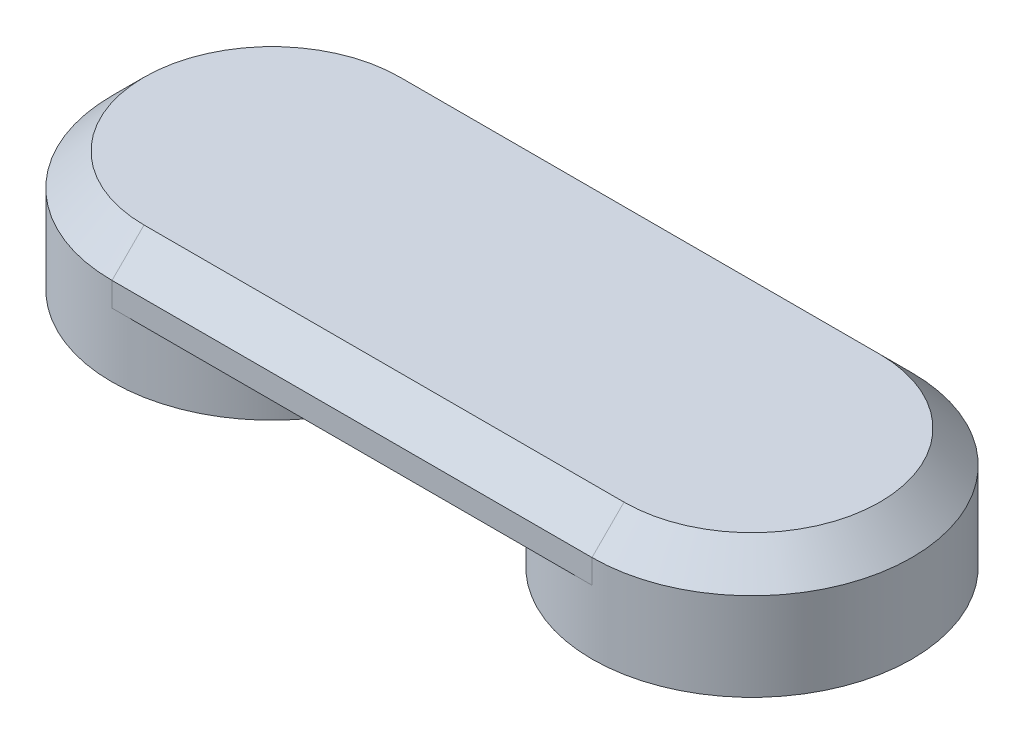
ISO-10303-21;
HEADER;
FILE_DESCRIPTION(('STEP AP214'),'2;1');
FILE_NAME('part.step','',(''),(''),'','','');
FILE_SCHEMA(('AUTOMOTIVE_DESIGN { 1 0 10303 214 1 1 1 1 }'));
ENDSEC;
DATA;
#1=APPLICATION_CONTEXT('core data for automotive mechanical design processes');
#2=APPLICATION_PROTOCOL_DEFINITION('international standard','automotive_design',2000,#1);
#3=PRODUCT_CONTEXT('',#1,'mechanical');
#4=PRODUCT('Part','Part','',(#3));
#5=PRODUCT_RELATED_PRODUCT_CATEGORY('part','',(#4));
#6=PRODUCT_DEFINITION_FORMATION('','',#4);
#7=PRODUCT_DEFINITION_CONTEXT('part definition',#1,'design');
#8=PRODUCT_DEFINITION('design','',#6,#7);
#9=PRODUCT_DEFINITION_SHAPE('','',#8);
#10=(LENGTH_UNIT() NAMED_UNIT(*) SI_UNIT(.MILLI.,.METRE.));
#11=(NAMED_UNIT(*) PLANE_ANGLE_UNIT() SI_UNIT($,.RADIAN.));
#12=(NAMED_UNIT(*) SI_UNIT($,.STERADIAN.) SOLID_ANGLE_UNIT());
#13=UNCERTAINTY_MEASURE_WITH_UNIT(LENGTH_MEASURE(1.E-05),#10,'distance_accuracy_value','');
#14=(GEOMETRIC_REPRESENTATION_CONTEXT(3) GLOBAL_UNCERTAINTY_ASSIGNED_CONTEXT((#13)) GLOBAL_UNIT_ASSIGNED_CONTEXT((#10,
#11,#12)) REPRESENTATION_CONTEXT('',''));
#15=CARTESIAN_POINT('',(0.,0.,0.));
#16=DIRECTION('',(0.,0.,1.));
#17=DIRECTION('',(1.,0.,0.));
#18=AXIS2_PLACEMENT_3D('',#15,#16,#17);
#19=CARTESIAN_POINT('',(30.,15.,-20.));
#20=DIRECTION('',(0.,0.,1.));
#21=DIRECTION('',(1.,0.,0.));
#22=AXIS2_PLACEMENT_3D('',#19,#20,#21);
#23=PLANE('',#22);
#24=DIRECTION('',(1.,0.,0.));
#25=VECTOR('',#24,1.);
#26=CARTESIAN_POINT('',(30.,8.,-20.));
#27=LINE('',#26,#25);
#28=CARTESIAN_POINT('',(-30.,8.,-20.));
#29=VERTEX_POINT('',#28);
#30=CARTESIAN_POINT('',(30.,8.,-20.));
#31=VERTEX_POINT('',#30);
#32=EDGE_CURVE('E97',#29,#31,#27,.T.);
#33=ORIENTED_EDGE('',*,*,#32,.F.);
#34=DIRECTION('',(0.,-1.,0.));
#35=VECTOR('',#34,1.);
#36=CARTESIAN_POINT('',(-30.,15.,-20.));
#37=LINE('',#36,#35);
#38=CARTESIAN_POINT('',(-30.,11.,-20.));
#39=VERTEX_POINT('',#38);
#40=EDGE_CURVE('E124',#39,#29,#37,.T.);
#41=ORIENTED_EDGE('',*,*,#40,.F.);
#42=DIRECTION('',(1.,0.,0.));
#43=VECTOR('',#42,1.);
#44=CARTESIAN_POINT('',(30.,11.,-20.));
#45=LINE('',#44,#43);
#46=CARTESIAN_POINT('',(30.,11.,-20.));
#47=VERTEX_POINT('',#46);
#48=EDGE_CURVE('E121',#39,#47,#45,.T.);
#49=ORIENTED_EDGE('',*,*,#48,.T.);
#50=DIRECTION('',(0.,-1.,0.));
#51=VECTOR('',#50,1.);
#52=CARTESIAN_POINT('',(30.,15.,-20.));
#53=LINE('',#52,#51);
#54=EDGE_CURVE('E114',#47,#31,#53,.T.);
#55=ORIENTED_EDGE('',*,*,#54,.T.);
#56=EDGE_LOOP('',(#33,#41,#49,#55));
#57=FACE_BOUND('',#56,.T.);
#58=ADVANCED_FACE('F42',(#57),#23,.F.);
#59=CARTESIAN_POINT('',(30.,15.,20.));
#60=DIRECTION('',(0.,0.,-1.));
#61=DIRECTION('',(-1.,0.,0.));
#62=AXIS2_PLACEMENT_3D('',#59,#60,#61);
#63=PLANE('',#62);
#64=DIRECTION('',(-1.,0.,0.));
#65=VECTOR('',#64,1.);
#66=CARTESIAN_POINT('',(30.,8.,20.));
#67=LINE('',#66,#65);
#68=CARTESIAN_POINT('',(30.,8.,20.));
#69=VERTEX_POINT('',#68);
#70=CARTESIAN_POINT('',(-30.,8.,20.));
#71=VERTEX_POINT('',#70);
#72=EDGE_CURVE('E12',#69,#71,#67,.T.);
#73=ORIENTED_EDGE('',*,*,#72,.F.);
#74=DIRECTION('',(0.,-1.,0.));
#75=VECTOR('',#74,1.);
#76=CARTESIAN_POINT('',(30.,15.,20.));
#77=LINE('',#76,#75);
#78=CARTESIAN_POINT('',(30.,11.,20.));
#79=VERTEX_POINT('',#78);
#80=EDGE_CURVE('E116',#79,#69,#77,.T.);
#81=ORIENTED_EDGE('',*,*,#80,.F.);
#82=DIRECTION('',(-1.,0.,0.));
#83=VECTOR('',#82,1.);
#84=CARTESIAN_POINT('',(-30.,11.,20.));
#85=LINE('',#84,#83);
#86=CARTESIAN_POINT('',(-30.,11.,20.));
#87=VERTEX_POINT('',#86);
#88=EDGE_CURVE('E59',#79,#87,#85,.T.);
#89=ORIENTED_EDGE('',*,*,#88,.T.);
#90=DIRECTION('',(0.,-1.,0.));
#91=VECTOR('',#90,1.);
#92=CARTESIAN_POINT('',(-30.,15.,20.));
#93=LINE('',#92,#91);
#94=EDGE_CURVE('E130',#87,#71,#93,.T.);
#95=ORIENTED_EDGE('',*,*,#94,.T.);
#96=EDGE_LOOP('',(#73,#81,#89,#95));
#97=FACE_BOUND('',#96,.T.);
#98=ADVANCED_FACE('F180',(#97),#63,.F.);
#99=CARTESIAN_POINT('',(30.,0.,0.));
#100=DIRECTION('',(0.,1.,0.));
#101=DIRECTION('',(0.,0.,1.));
#102=AXIS2_PLACEMENT_3D('',#99,#100,#101);
#103=PLANE('',#102);
#104=CARTESIAN_POINT('',(-30.,0.,0.));
#105=DIRECTION('',(0.,1.,0.));
#106=DIRECTION('',(0.,0.,1.));
#107=AXIS2_PLACEMENT_3D('',#104,#105,#106);
#108=CIRCLE('',#107,20.);
#109=CARTESIAN_POINT('',(-30.,0.,20.));
#110=VERTEX_POINT('',#109);
#111=EDGE_CURVE('E169',#110,#110,#108,.T.);
#112=ORIENTED_EDGE('',*,*,#111,.F.);
#113=EDGE_LOOP('',(#112));
#114=FACE_BOUND('',#113,.T.);
#115=ADVANCED_FACE('F207',(#114),#103,.F.);
#116=CARTESIAN_POINT('',(30.,0.,0.));
#117=DIRECTION('',(0.,1.,0.));
#118=DIRECTION('',(0.,0.,1.));
#119=AXIS2_PLACEMENT_3D('',#116,#117,#118);
#120=CIRCLE('',#119,20.);
#121=CARTESIAN_POINT('',(30.,0.,20.));
#122=VERTEX_POINT('',#121);
#123=EDGE_CURVE('E163',#122,#122,#120,.T.);
#124=ORIENTED_EDGE('',*,*,#123,.F.);
#125=EDGE_LOOP('',(#124));
#126=FACE_BOUND('',#125,.T.);
#127=ADVANCED_FACE('F213',(#126),#103,.F.);
#128=CARTESIAN_POINT('',(30.,15.,0.));
#129=DIRECTION('',(0.,-1.,0.));
#130=DIRECTION('',(0.,0.,-1.));
#131=AXIS2_PLACEMENT_3D('',#128,#129,#130);
#132=CYLINDRICAL_SURFACE('',#131,20.);
#133=ORIENTED_EDGE('',*,*,#123,.T.);
#134=EDGE_LOOP('',(#133));
#135=FACE_BOUND('',#134,.T.);
#136=CARTESIAN_POINT('',(30.,8.,0.));
#137=DIRECTION('',(0.,-1.,0.));
#138=DIRECTION('',(0.,0.,-1.));
#139=AXIS2_PLACEMENT_3D('',#136,#137,#138);
#140=CIRCLE('',#139,20.);
#141=EDGE_CURVE('E100',#69,#31,#140,.T.);
#142=ORIENTED_EDGE('',*,*,#141,.T.);
#143=ORIENTED_EDGE('',*,*,#54,.F.);
#144=CARTESIAN_POINT('',(30.,11.,0.));
#145=DIRECTION('',(0.,1.,0.));
#146=DIRECTION('',(0.,0.,1.));
#147=AXIS2_PLACEMENT_3D('',#144,#145,#146);
#148=CIRCLE('',#147,20.);
#149=EDGE_CURVE('E143',#47,#79,#148,.F.);
#150=ORIENTED_EDGE('',*,*,#149,.T.);
#151=ORIENTED_EDGE('',*,*,#80,.T.);
#152=EDGE_LOOP('',(#142,#143,#150,#151));
#153=FACE_BOUND('',#152,.T.);
#154=ADVANCED_FACE('F112',(#135,#153),#132,.T.);
#155=CARTESIAN_POINT('',(-30.,15.,0.));
#156=DIRECTION('',(0.,-1.,0.));
#157=DIRECTION('',(0.,0.,-1.));
#158=AXIS2_PLACEMENT_3D('',#155,#156,#157);
#159=CYLINDRICAL_SURFACE('',#158,20.);
#160=ORIENTED_EDGE('',*,*,#111,.T.);
#161=EDGE_LOOP('',(#160));
#162=FACE_BOUND('',#161,.T.);
#163=ORIENTED_EDGE('',*,*,#40,.T.);
#164=CARTESIAN_POINT('',(-30.,8.,0.));
#165=DIRECTION('',(0.,-1.,0.));
#166=DIRECTION('',(0.,0.,-1.));
#167=AXIS2_PLACEMENT_3D('',#164,#165,#166);
#168=CIRCLE('',#167,20.);
#169=EDGE_CURVE('E103',#29,#71,#168,.T.);
#170=ORIENTED_EDGE('',*,*,#169,.T.);
#171=ORIENTED_EDGE('',*,*,#94,.F.);
#172=CARTESIAN_POINT('',(-30.,11.,0.));
#173=DIRECTION('',(0.,1.,0.));
#174=DIRECTION('',(0.,0.,1.));
#175=AXIS2_PLACEMENT_3D('',#172,#173,#174);
#176=CIRCLE('',#175,20.);
#177=EDGE_CURVE('E52',#87,#39,#176,.F.);
#178=ORIENTED_EDGE('',*,*,#177,.T.);
#179=EDGE_LOOP('',(#163,#170,#171,#178));
#180=FACE_BOUND('',#179,.T.);
#181=ADVANCED_FACE('F181',(#162,#180),#159,.T.);
#182=CARTESIAN_POINT('',(30.,15.,0.));
#183=DIRECTION('',(0.,1.,0.));
#184=DIRECTION('',(0.,0.,1.));
#185=AXIS2_PLACEMENT_3D('',#182,#183,#184);
#186=PLANE('',#185);
#187=DIRECTION('',(1.,0.,0.));
#188=VECTOR('',#187,1.);
#189=CARTESIAN_POINT('',(30.,15.,16.));
#190=LINE('',#189,#188);
#191=CARTESIAN_POINT('',(-30.,15.,16.));
#192=VERTEX_POINT('',#191);
#193=CARTESIAN_POINT('',(30.,15.,16.));
#194=VERTEX_POINT('',#193);
#195=EDGE_CURVE('E128',#192,#194,#190,.T.);
#196=ORIENTED_EDGE('',*,*,#195,.T.);
#197=CARTESIAN_POINT('',(30.,15.,0.));
#198=DIRECTION('',(0.,1.,0.));
#199=DIRECTION('',(0.,0.,1.));
#200=AXIS2_PLACEMENT_3D('',#197,#198,#199);
#201=CIRCLE('',#200,16.);
#202=CARTESIAN_POINT('',(30.,15.,-16.));
#203=VERTEX_POINT('',#202);
#204=EDGE_CURVE('E139',#194,#203,#201,.T.);
#205=ORIENTED_EDGE('',*,*,#204,.T.);
#206=DIRECTION('',(-1.,0.,0.));
#207=VECTOR('',#206,1.);
#208=CARTESIAN_POINT('',(-30.,15.,-16.));
#209=LINE('',#208,#207);
#210=CARTESIAN_POINT('',(-30.,15.,-16.));
#211=VERTEX_POINT('',#210);
#212=EDGE_CURVE('E136',#203,#211,#209,.T.);
#213=ORIENTED_EDGE('',*,*,#212,.T.);
#214=CARTESIAN_POINT('',(-30.,15.,0.));
#215=DIRECTION('',(0.,1.,0.));
#216=DIRECTION('',(0.,0.,1.));
#217=AXIS2_PLACEMENT_3D('',#214,#215,#216);
#218=CIRCLE('',#217,16.);
#219=EDGE_CURVE('E123',#211,#192,#218,.T.);
#220=ORIENTED_EDGE('',*,*,#219,.T.);
#221=EDGE_LOOP('',(#196,#205,#213,#220));
#222=FACE_BOUND('',#221,.T.);
#223=ADVANCED_FACE('F200',(#222),#186,.T.);
#224=CARTESIAN_POINT('',(-30.,15.,0.));
#225=DIRECTION('',(0.,-1.,0.));
#226=DIRECTION('',(0.,0.,-1.));
#227=AXIS2_PLACEMENT_3D('',#224,#225,#226);
#228=CONICAL_SURFACE('',#227,16.,0.785398163397447);
#229=DIRECTION('',(0.,0.707106781186548,0.707106781186547));
#230=VECTOR('',#229,1.);
#231=CARTESIAN_POINT('',(-30.,11.,-20.));
#232=LINE('',#231,#230);
#233=EDGE_CURVE('E157',#39,#211,#232,.T.);
#234=ORIENTED_EDGE('',*,*,#233,.F.);
#235=ORIENTED_EDGE('',*,*,#177,.F.);
#236=DIRECTION('',(0.,-0.707106781186548,0.707106781186547));
#237=VECTOR('',#236,1.);
#238=CARTESIAN_POINT('',(-30.,15.,16.));
#239=LINE('',#238,#237);
#240=EDGE_CURVE('E160',#192,#87,#239,.T.);
#241=ORIENTED_EDGE('',*,*,#240,.F.);
#242=ORIENTED_EDGE('',*,*,#219,.F.);
#243=EDGE_LOOP('',(#234,#235,#241,#242));
#244=FACE_BOUND('',#243,.T.);
#245=ADVANCED_FACE('F45',(#244),#228,.T.);
#246=CARTESIAN_POINT('',(30.,15.,16.));
#247=DIRECTION('',(0.,0.707106781186547,0.707106781186548));
#248=DIRECTION('',(-1.,0.,0.));
#249=AXIS2_PLACEMENT_3D('',#246,#247,#248);
#250=PLANE('',#249);
#251=ORIENTED_EDGE('',*,*,#240,.T.);
#252=ORIENTED_EDGE('',*,*,#88,.F.);
#253=DIRECTION('',(0.,-0.707106781186548,0.707106781186547));
#254=VECTOR('',#253,1.);
#255=CARTESIAN_POINT('',(30.,15.,16.));
#256=LINE('',#255,#254);
#257=EDGE_CURVE('E154',#194,#79,#256,.T.);
#258=ORIENTED_EDGE('',*,*,#257,.F.);
#259=ORIENTED_EDGE('',*,*,#195,.F.);
#260=EDGE_LOOP('',(#251,#252,#258,#259));
#261=FACE_BOUND('',#260,.T.);
#262=ADVANCED_FACE('F193',(#261),#250,.T.);
#263=CARTESIAN_POINT('',(30.,15.,-16.));
#264=DIRECTION('',(0.,0.707106781186547,-0.707106781186548));
#265=DIRECTION('',(1.,0.,0.));
#266=AXIS2_PLACEMENT_3D('',#263,#264,#265);
#267=PLANE('',#266);
#268=ORIENTED_EDGE('',*,*,#233,.T.);
#269=ORIENTED_EDGE('',*,*,#212,.F.);
#270=DIRECTION('',(0.,0.707106781186548,0.707106781186547));
#271=VECTOR('',#270,1.);
#272=CARTESIAN_POINT('',(30.,11.,-20.));
#273=LINE('',#272,#271);
#274=EDGE_CURVE('E107',#47,#203,#273,.T.);
#275=ORIENTED_EDGE('',*,*,#274,.F.);
#276=ORIENTED_EDGE('',*,*,#48,.F.);
#277=EDGE_LOOP('',(#268,#269,#275,#276));
#278=FACE_BOUND('',#277,.T.);
#279=ADVANCED_FACE('F188',(#278),#267,.T.);
#280=CARTESIAN_POINT('',(30.,15.,0.));
#281=DIRECTION('',(0.,-1.,0.));
#282=DIRECTION('',(0.,0.,-1.));
#283=AXIS2_PLACEMENT_3D('',#280,#281,#282);
#284=CONICAL_SURFACE('',#283,16.,0.785398163397447);
#285=ORIENTED_EDGE('',*,*,#257,.T.);
#286=ORIENTED_EDGE('',*,*,#149,.F.);
#287=ORIENTED_EDGE('',*,*,#274,.T.);
#288=ORIENTED_EDGE('',*,*,#204,.F.);
#289=EDGE_LOOP('',(#285,#286,#287,#288));
#290=FACE_BOUND('',#289,.T.);
#291=ADVANCED_FACE('F191',(#290),#284,.T.);
#292=CARTESIAN_POINT('',(0.,8.,0.));
#293=DIRECTION('',(0.,-1.,0.));
#294=DIRECTION('',(0.,0.,-1.));
#295=AXIS2_PLACEMENT_3D('',#292,#293,#294);
#296=PLANE('',#295);
#297=CARTESIAN_POINT('',(0.,8.,0.));
#298=DIRECTION('',(0.,-1.,0.));
#299=DIRECTION('',(0.,0.,-1.));
#300=AXIS2_PLACEMENT_3D('',#297,#298,#299);
#301=CIRCLE('',#300,5.);
#302=CARTESIAN_POINT('',(0.,8.,-5.));
#303=VERTEX_POINT('',#302);
#304=EDGE_CURVE('E335',#303,#303,#301,.T.);
#305=ORIENTED_EDGE('',*,*,#304,.F.);
#306=EDGE_LOOP('',(#305));
#307=FACE_BOUND('',#306,.T.);
#308=ORIENTED_EDGE('',*,*,#32,.T.);
#309=ORIENTED_EDGE('',*,*,#141,.F.);
#310=ORIENTED_EDGE('',*,*,#72,.T.);
#311=ORIENTED_EDGE('',*,*,#169,.F.);
#312=EDGE_LOOP('',(#308,#309,#310,#311));
#313=FACE_BOUND('',#312,.T.);
#314=ADVANCED_FACE('F99',(#307,#313),#296,.T.);
#315=CARTESIAN_POINT('',(0.,-6.,0.));
#316=DIRECTION('',(0.,1.,0.));
#317=DIRECTION('',(0.,0.,1.));
#318=AXIS2_PLACEMENT_3D('',#315,#316,#317);
#319=CYLINDRICAL_SURFACE('',#318,5.);
#320=CARTESIAN_POINT('',(0.,-6.,0.));
#321=DIRECTION('',(0.,-1.,0.));
#322=DIRECTION('',(0.,0.,-1.));
#323=AXIS2_PLACEMENT_3D('',#320,#321,#322);
#324=CIRCLE('',#323,5.);
#325=CARTESIAN_POINT('',(0.,-6.,-5.));
#326=VERTEX_POINT('',#325);
#327=EDGE_CURVE('E118',#326,#326,#324,.T.);
#328=ORIENTED_EDGE('',*,*,#327,.F.);
#329=EDGE_LOOP('',(#328));
#330=FACE_BOUND('',#329,.T.);
#331=ORIENTED_EDGE('',*,*,#304,.T.);
#332=EDGE_LOOP('',(#331));
#333=FACE_BOUND('',#332,.T.);
#334=ADVANCED_FACE('F228',(#330,#333),#319,.T.);
#335=CARTESIAN_POINT('',(0.,-6.,0.));
#336=DIRECTION('',(0.,-1.,0.));
#337=DIRECTION('',(0.,0.,-1.));
#338=AXIS2_PLACEMENT_3D('',#335,#336,#337);
#339=PLANE('',#338);
#340=ORIENTED_EDGE('',*,*,#327,.T.);
#341=EDGE_LOOP('',(#340));
#342=FACE_BOUND('',#341,.T.);
#343=ADVANCED_FACE('F234',(#342),#339,.T.);
#344=CLOSED_SHELL('',(#58,#98,#115,#127,#154,#181,#223,#245,#262,#279,#291,#314,#334,#343));
#345=MANIFOLD_SOLID_BREP('B2',#344);
#346=ADVANCED_BREP_SHAPE_REPRESENTATION('',(#18,#345),#14);
#347=SHAPE_DEFINITION_REPRESENTATION(#9,#346);
ENDSEC;
END-ISO-10303-21;
